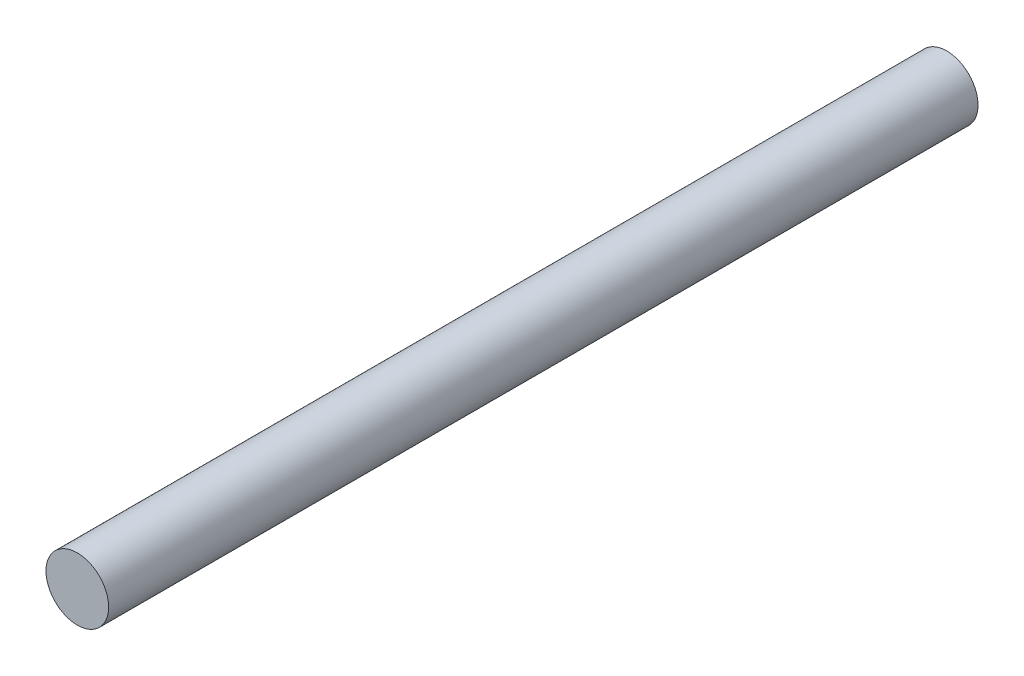
ISO-10303-21;
HEADER;
FILE_DESCRIPTION(('STEP AP214'),'2;1');
FILE_NAME('part.step','',(''),(''),'','','');
FILE_SCHEMA(('AUTOMOTIVE_DESIGN { 1 0 10303 214 1 1 1 1 }'));
ENDSEC;
DATA;
#1=APPLICATION_CONTEXT('core data for automotive mechanical design processes');
#2=APPLICATION_PROTOCOL_DEFINITION('international standard','automotive_design',2000,#1);
#3=PRODUCT_CONTEXT('',#1,'mechanical');
#4=PRODUCT('Part','Part','',(#3));
#5=PRODUCT_RELATED_PRODUCT_CATEGORY('part','',(#4));
#6=PRODUCT_DEFINITION_FORMATION('','',#4);
#7=PRODUCT_DEFINITION_CONTEXT('part definition',#1,'design');
#8=PRODUCT_DEFINITION('design','',#6,#7);
#9=PRODUCT_DEFINITION_SHAPE('','',#8);
#10=(LENGTH_UNIT() NAMED_UNIT(*) SI_UNIT(.MILLI.,.METRE.));
#11=(NAMED_UNIT(*) PLANE_ANGLE_UNIT() SI_UNIT($,.RADIAN.));
#12=(NAMED_UNIT(*) SI_UNIT($,.STERADIAN.) SOLID_ANGLE_UNIT());
#13=UNCERTAINTY_MEASURE_WITH_UNIT(LENGTH_MEASURE(1.E-05),#10,'distance_accuracy_value','');
#14=(GEOMETRIC_REPRESENTATION_CONTEXT(3) GLOBAL_UNCERTAINTY_ASSIGNED_CONTEXT((#13)) GLOBAL_UNIT_ASSIGNED_CONTEXT((#10,
#11,#12)) REPRESENTATION_CONTEXT('',''));
#15=CARTESIAN_POINT('',(0.,0.,0.));
#16=DIRECTION('',(0.,0.,1.));
#17=DIRECTION('',(1.,0.,0.));
#18=AXIS2_PLACEMENT_3D('',#15,#16,#17);
#19=CARTESIAN_POINT('',(0.,0.,44.07));
#20=DIRECTION('',(0.,0.,-1.));
#21=DIRECTION('',(-1.,0.,0.));
#22=AXIS2_PLACEMENT_3D('',#19,#20,#21);
#23=CYLINDRICAL_SURFACE('',#22,1.5875);
#24=CARTESIAN_POINT('',(0.,0.,44.07));
#25=DIRECTION('',(0.,0.,1.));
#26=DIRECTION('',(1.,0.,0.));
#27=AXIS2_PLACEMENT_3D('',#24,#25,#26);
#28=CIRCLE('',#27,1.5875);
#29=CARTESIAN_POINT('',(-1.5875,0.,44.07));
#30=VERTEX_POINT('',#29);
#31=EDGE_CURVE('E10',#30,#30,#28,.T.);
#32=CARTESIAN_POINT('',(0.,0.,0.));
#33=DIRECTION('',(0.,0.,1.));
#34=DIRECTION('',(1.,0.,0.));
#35=AXIS2_PLACEMENT_3D('',#32,#33,#34);
#36=CIRCLE('',#35,1.5875);
#37=CARTESIAN_POINT('',(-1.5875,0.,0.));
#38=VERTEX_POINT('',#37);
#39=EDGE_CURVE('E34',#38,#38,#36,.T.);
#40=CARTESIAN_POINT('',(-1.5875,0.,44.07));
#41=CARTESIAN_POINT('',(-1.5875,0.,43.6109375));
#42=CARTESIAN_POINT('',(-1.5875,0.,43.151875));
#43=CARTESIAN_POINT('',(-1.5875,0.,42.23375));
#44=CARTESIAN_POINT('',(-1.5875,0.,41.7746875));
#45=CARTESIAN_POINT('',(-1.5875,0.,40.8565625));
#46=CARTESIAN_POINT('',(-1.5875,0.,40.3975));
#47=CARTESIAN_POINT('',(-1.5875,0.,39.479375));
#48=CARTESIAN_POINT('',(-1.5875,0.,39.0203125));
#49=CARTESIAN_POINT('',(-1.5875,0.,38.1021875));
#50=CARTESIAN_POINT('',(-1.5875,0.,37.643125));
#51=CARTESIAN_POINT('',(-1.5875,0.,36.725));
#52=CARTESIAN_POINT('',(-1.5875,0.,36.2659375));
#53=CARTESIAN_POINT('',(-1.5875,0.,35.3478125));
#54=CARTESIAN_POINT('',(-1.5875,0.,34.88875));
#55=CARTESIAN_POINT('',(-1.5875,0.,33.970625));
#56=CARTESIAN_POINT('',(-1.5875,0.,33.5115625));
#57=CARTESIAN_POINT('',(-1.5875,0.,32.5934375));
#58=CARTESIAN_POINT('',(-1.5875,0.,32.134375));
#59=CARTESIAN_POINT('',(-1.5875,0.,31.21625));
#60=CARTESIAN_POINT('',(-1.5875,0.,30.7571875));
#61=CARTESIAN_POINT('',(-1.5875,0.,29.8390625));
#62=CARTESIAN_POINT('',(-1.5875,0.,29.38));
#63=CARTESIAN_POINT('',(-1.5875,0.,28.461875));
#64=CARTESIAN_POINT('',(-1.5875,0.,28.0028125));
#65=CARTESIAN_POINT('',(-1.5875,0.,27.0846875));
#66=CARTESIAN_POINT('',(-1.5875,0.,26.625625));
#67=CARTESIAN_POINT('',(-1.5875,0.,25.7075));
#68=CARTESIAN_POINT('',(-1.5875,0.,25.2484375));
#69=CARTESIAN_POINT('',(-1.5875,0.,24.3303125));
#70=CARTESIAN_POINT('',(-1.5875,0.,23.87125));
#71=CARTESIAN_POINT('',(-1.5875,0.,22.953125));
#72=CARTESIAN_POINT('',(-1.5875,0.,22.4940625));
#73=CARTESIAN_POINT('',(-1.5875,0.,21.5759375));
#74=CARTESIAN_POINT('',(-1.5875,0.,21.116875));
#75=CARTESIAN_POINT('',(-1.5875,0.,20.19875));
#76=CARTESIAN_POINT('',(-1.5875,0.,19.7396875));
#77=CARTESIAN_POINT('',(-1.5875,0.,18.8215625));
#78=CARTESIAN_POINT('',(-1.5875,0.,18.3625));
#79=CARTESIAN_POINT('',(-1.5875,0.,17.444375));
#80=CARTESIAN_POINT('',(-1.5875,0.,16.9853125));
#81=CARTESIAN_POINT('',(-1.5875,0.,16.0671875));
#82=CARTESIAN_POINT('',(-1.5875,0.,15.608125));
#83=CARTESIAN_POINT('',(-1.5875,0.,14.69));
#84=CARTESIAN_POINT('',(-1.5875,0.,14.2309375));
#85=CARTESIAN_POINT('',(-1.5875,0.,13.3128125));
#86=CARTESIAN_POINT('',(-1.5875,0.,12.85375));
#87=CARTESIAN_POINT('',(-1.5875,0.,11.935625));
#88=CARTESIAN_POINT('',(-1.5875,0.,11.4765625));
#89=CARTESIAN_POINT('',(-1.5875,0.,10.5584375));
#90=CARTESIAN_POINT('',(-1.5875,0.,10.099375));
#91=CARTESIAN_POINT('',(-1.5875,0.,9.18124999999999));
#92=CARTESIAN_POINT('',(-1.5875,0.,8.72218749999999));
#93=CARTESIAN_POINT('',(-1.5875,0.,7.8040625));
#94=CARTESIAN_POINT('',(-1.5875,0.,7.34499999999999));
#95=CARTESIAN_POINT('',(-1.5875,0.,6.42687499999999));
#96=CARTESIAN_POINT('',(-1.5875,0.,5.96781249999999));
#97=CARTESIAN_POINT('',(-1.5875,0.,5.04968749999999));
#98=CARTESIAN_POINT('',(-1.5875,0.,4.59062499999999));
#99=CARTESIAN_POINT('',(-1.5875,0.,3.67249999999999));
#100=CARTESIAN_POINT('',(-1.5875,0.,3.2134375));
#101=CARTESIAN_POINT('',(-1.5875,0.,2.2953125));
#102=CARTESIAN_POINT('',(-1.5875,0.,1.83625));
#103=CARTESIAN_POINT('',(-1.5875,0.,0.918124999999994));
#104=CARTESIAN_POINT('',(-1.5875,0.,0.459062499999994));
#105=CARTESIAN_POINT('',(-1.5875,0.,0.));
#106=B_SPLINE_CURVE_WITH_KNOTS('',3,(#40,#41,#42,#43,#44,#45,#46,#47,#48,#49,#50,#51,#52,#53,
#54,#55,#56,#57,#58,#59,#60,#61,#62,#63,#64,#65,#66,#67,#68,#69,#70,#71,#72,#73,#74,#75,#76,#77,
#78,#79,#80,#81,#82,#83,#84,#85,#86,#87,#88,#89,#90,#91,#92,#93,#94,#95,#96,#97,#98,#99,#100,
#101,#102,#103,#104,#105),.UNSPECIFIED.,.F.,.F.,(4,2,2,2,2,2,2,2,2,2,2,2,2,2,2,2,2,2,2,2,2,2,2,
2,2,2,2,2,2,2,2,2,4),(0.,1.37718749999999,2.754375,4.1315625,5.50875,6.88593749999999,8.263125,
9.6403125,11.0175,12.3946875,13.771875,15.1490625,16.52625,17.9034375,19.280625,20.6578125,
22.035,23.4121875,24.789375,26.1665625,27.54375,28.9209375,30.298125,31.6753125,33.0525,
34.4296875,35.806875,37.1840625,38.56125,39.9384375,41.315625,42.6928125,44.07),.UNSPECIFIED.);
#107=EDGE_CURVE('BSEAM31',#30,#38,#106,.T.);
#108=ORIENTED_EDGE('',*,*,#31,.F.);
#109=ORIENTED_EDGE('',*,*,#39,.T.);
#110=ORIENTED_EDGE('',*,*,#107,.T.);
#111=ORIENTED_EDGE('',*,*,#107,.F.);
#112=EDGE_LOOP('',(#108,#110,#109,#111));
#113=FACE_BOUND('',#112,.T.);
#114=ADVANCED_FACE('F31',(#113),#23,.T.);
#115=CARTESIAN_POINT('',(0.,0.,44.07));
#116=DIRECTION('',(0.,0.,1.));
#117=DIRECTION('',(1.,0.,0.));
#118=AXIS2_PLACEMENT_3D('',#115,#116,#117);
#119=PLANE('',#118);
#120=ORIENTED_EDGE('',*,*,#31,.T.);
#121=EDGE_LOOP('',(#120));
#122=FACE_BOUND('',#121,.T.);
#123=ADVANCED_FACE('F46',(#122),#119,.T.);
#124=CARTESIAN_POINT('',(0.,0.,0.));
#125=DIRECTION('',(0.,0.,1.));
#126=DIRECTION('',(1.,0.,0.));
#127=AXIS2_PLACEMENT_3D('',#124,#125,#126);
#128=PLANE('',#127);
#129=ORIENTED_EDGE('',*,*,#39,.F.);
#130=EDGE_LOOP('',(#129));
#131=FACE_BOUND('',#130,.T.);
#132=ADVANCED_FACE('F44',(#131),#128,.F.);
#133=CLOSED_SHELL('',(#114,#123,#132));
#134=MANIFOLD_SOLID_BREP('B2',#133);
#135=ADVANCED_BREP_SHAPE_REPRESENTATION('',(#18,#134),#14);
#136=SHAPE_DEFINITION_REPRESENTATION(#9,#135);
ENDSEC;
END-ISO-10303-21;
